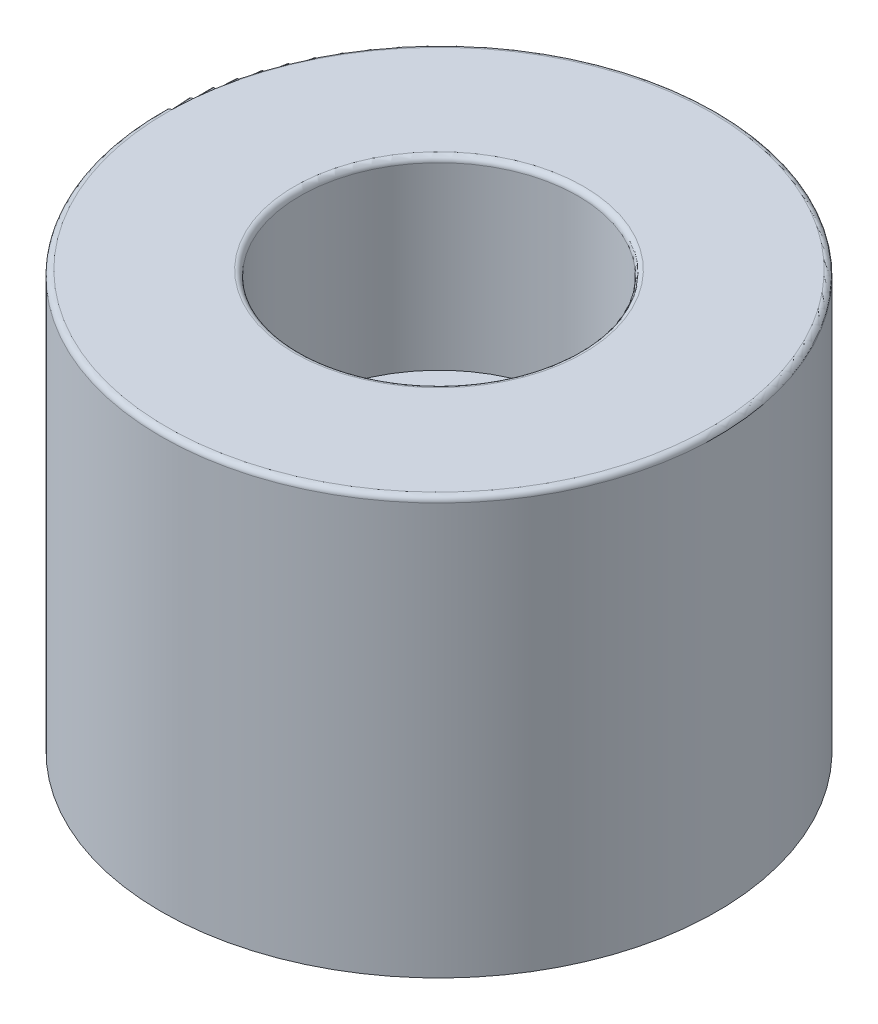
ISO-10303-21;
HEADER;
FILE_DESCRIPTION(('STEP AP214'),'2;1');
FILE_NAME('part.step','',(''),(''),'','','');
FILE_SCHEMA(('AUTOMOTIVE_DESIGN { 1 0 10303 214 1 1 1 1 }'));
ENDSEC;
DATA;
#1=APPLICATION_CONTEXT('core data for automotive mechanical design processes');
#2=APPLICATION_PROTOCOL_DEFINITION('international standard','automotive_design',2000,#1);
#3=PRODUCT_CONTEXT('',#1,'mechanical');
#4=PRODUCT('Part','Part','',(#3));
#5=PRODUCT_RELATED_PRODUCT_CATEGORY('part','',(#4));
#6=PRODUCT_DEFINITION_FORMATION('','',#4);
#7=PRODUCT_DEFINITION_CONTEXT('part definition',#1,'design');
#8=PRODUCT_DEFINITION('design','',#6,#7);
#9=PRODUCT_DEFINITION_SHAPE('','',#8);
#10=(LENGTH_UNIT() NAMED_UNIT(*) SI_UNIT(.MILLI.,.METRE.));
#11=(NAMED_UNIT(*) PLANE_ANGLE_UNIT() SI_UNIT($,.RADIAN.));
#12=(NAMED_UNIT(*) SI_UNIT($,.STERADIAN.) SOLID_ANGLE_UNIT());
#13=UNCERTAINTY_MEASURE_WITH_UNIT(LENGTH_MEASURE(1.E-05),#10,'distance_accuracy_value','');
#14=(GEOMETRIC_REPRESENTATION_CONTEXT(3) GLOBAL_UNCERTAINTY_ASSIGNED_CONTEXT((#13)) GLOBAL_UNIT_ASSIGNED_CONTEXT((#10,
#11,#12)) REPRESENTATION_CONTEXT('',''));
#15=CARTESIAN_POINT('',(0.,0.,0.));
#16=DIRECTION('',(0.,0.,1.));
#17=DIRECTION('',(1.,0.,0.));
#18=AXIS2_PLACEMENT_3D('',#15,#16,#17);
#19=CARTESIAN_POINT('',(-2.38125,-7.14375,0.));
#20=DIRECTION('',(0.,1.,0.));
#21=DIRECTION('',(0.,0.,1.));
#22=AXIS2_PLACEMENT_3D('',#19,#20,#21);
#23=PLANE('',#22);
#24=CARTESIAN_POINT('',(0.,-7.14375,0.));
#25=DIRECTION('',(0.,-1.,0.));
#26=DIRECTION('',(0.,0.,-1.));
#27=AXIS2_PLACEMENT_3D('',#24,#25,#26);
#28=CIRCLE('',#27,2.38125);
#29=CARTESIAN_POINT('',(0.,-7.14375,-2.38125));
#30=VERTEX_POINT('',#29);
#31=EDGE_CURVE('E83',#30,#30,#28,.T.);
#32=ORIENTED_EDGE('',*,*,#31,.F.);
#33=EDGE_LOOP('',(#32));
#34=FACE_BOUND('',#33,.T.);
#35=CARTESIAN_POINT('',(0.,-7.14375,0.));
#36=DIRECTION('',(0.,-1.,0.));
#37=DIRECTION('',(0.,0.,-1.));
#38=AXIS2_PLACEMENT_3D('',#35,#36,#37);
#39=CIRCLE('',#38,9.525);
#40=CARTESIAN_POINT('',(0.,-7.14375,-9.525));
#41=VERTEX_POINT('',#40);
#42=EDGE_CURVE('E71',#41,#41,#39,.T.);
#43=ORIENTED_EDGE('',*,*,#42,.T.);
#44=EDGE_LOOP('',(#43));
#45=FACE_BOUND('',#44,.T.);
#46=ADVANCED_FACE('F45',(#34,#45),#23,.F.);
#47=CARTESIAN_POINT('',(0.,-7.14375,0.));
#48=DIRECTION('',(0.,-1.,0.));
#49=DIRECTION('',(0.,0.,-1.));
#50=AXIS2_PLACEMENT_3D('',#47,#48,#49);
#51=CYLINDRICAL_SURFACE('',#50,9.525);
#52=CARTESIAN_POINT('',(0.,6.95325,0.));
#53=DIRECTION('',(0.,-1.,0.));
#54=DIRECTION('',(0.,0.,-1.));
#55=AXIS2_PLACEMENT_3D('',#52,#53,#54);
#56=CIRCLE('',#55,9.525);
#57=CARTESIAN_POINT('',(0.,6.95325,-9.525));
#58=VERTEX_POINT('',#57);
#59=EDGE_CURVE('E53',#58,#58,#56,.T.);
#60=ORIENTED_EDGE('',*,*,#59,.T.);
#61=EDGE_LOOP('',(#60));
#62=FACE_BOUND('',#61,.T.);
#63=ORIENTED_EDGE('',*,*,#42,.F.);
#64=EDGE_LOOP('',(#63));
#65=FACE_BOUND('',#64,.T.);
#66=ADVANCED_FACE('F93',(#62,#65),#51,.T.);
#67=CARTESIAN_POINT('',(-9.525,7.14375,0.));
#68=DIRECTION('',(0.,-1.,0.));
#69=DIRECTION('',(0.,0.,-1.));
#70=AXIS2_PLACEMENT_3D('',#67,#68,#69);
#71=PLANE('',#70);
#72=CARTESIAN_POINT('',(0.,7.14375,0.));
#73=DIRECTION('',(0.,-1.,0.));
#74=DIRECTION('',(0.,0.,-1.));
#75=AXIS2_PLACEMENT_3D('',#72,#73,#74);
#76=CIRCLE('',#75,9.3345);
#77=CARTESIAN_POINT('',(0.,7.14375,-9.3345));
#78=VERTEX_POINT('',#77);
#79=EDGE_CURVE('E10',#78,#78,#76,.F.);
#80=ORIENTED_EDGE('',*,*,#79,.T.);
#81=EDGE_LOOP('',(#80));
#82=FACE_BOUND('',#81,.T.);
#83=CARTESIAN_POINT('',(0.,7.14375,0.));
#84=DIRECTION('',(0.,-1.,0.));
#85=DIRECTION('',(0.,0.,-1.));
#86=AXIS2_PLACEMENT_3D('',#83,#84,#85);
#87=CIRCLE('',#86,4.953);
#88=CARTESIAN_POINT('',(0.,7.14375,-4.953));
#89=VERTEX_POINT('',#88);
#90=EDGE_CURVE('E65',#89,#89,#87,.T.);
#91=ORIENTED_EDGE('',*,*,#90,.T.);
#92=EDGE_LOOP('',(#91));
#93=FACE_BOUND('',#92,.T.);
#94=ADVANCED_FACE('F98',(#82,#93),#71,.F.);
#95=CARTESIAN_POINT('',(0.,-7.14375,0.));
#96=DIRECTION('',(0.,-1.,0.));
#97=DIRECTION('',(0.,0.,-1.));
#98=AXIS2_PLACEMENT_3D('',#95,#96,#97);
#99=CYLINDRICAL_SURFACE('',#98,4.7625);
#100=CARTESIAN_POINT('',(0.,6.95325,0.));
#101=DIRECTION('',(0.,-1.,0.));
#102=DIRECTION('',(0.,0.,-1.));
#103=AXIS2_PLACEMENT_3D('',#100,#101,#102);
#104=CIRCLE('',#103,4.7625);
#105=CARTESIAN_POINT('',(0.,6.95325,-4.7625));
#106=VERTEX_POINT('',#105);
#107=EDGE_CURVE('E59',#106,#106,#104,.F.);
#108=ORIENTED_EDGE('',*,*,#107,.T.);
#109=EDGE_LOOP('',(#108));
#110=FACE_BOUND('',#109,.T.);
#111=CARTESIAN_POINT('',(0.,0.793749999999999,0.));
#112=DIRECTION('',(0.,-1.,0.));
#113=DIRECTION('',(0.,0.,-1.));
#114=AXIS2_PLACEMENT_3D('',#111,#112,#113);
#115=CIRCLE('',#114,4.7625);
#116=CARTESIAN_POINT('',(0.,0.793749999999999,-4.7625));
#117=VERTEX_POINT('',#116);
#118=EDGE_CURVE('E75',#117,#117,#115,.T.);
#119=ORIENTED_EDGE('',*,*,#118,.T.);
#120=EDGE_LOOP('',(#119));
#121=FACE_BOUND('',#120,.T.);
#122=ADVANCED_FACE('F103',(#110,#121),#99,.F.);
#123=CARTESIAN_POINT('',(-4.7625,0.793749999999999,0.));
#124=DIRECTION('',(0.,-1.,0.));
#125=DIRECTION('',(0.,0.,-1.));
#126=AXIS2_PLACEMENT_3D('',#123,#124,#125);
#127=PLANE('',#126);
#128=ORIENTED_EDGE('',*,*,#118,.F.);
#129=EDGE_LOOP('',(#128));
#130=FACE_BOUND('',#129,.T.);
#131=CARTESIAN_POINT('',(0.,0.793749999999999,0.));
#132=DIRECTION('',(0.,-1.,0.));
#133=DIRECTION('',(0.,0.,-1.));
#134=AXIS2_PLACEMENT_3D('',#131,#132,#133);
#135=CIRCLE('',#134,2.38125);
#136=CARTESIAN_POINT('',(0.,0.793749999999999,-2.38125));
#137=VERTEX_POINT('',#136);
#138=EDGE_CURVE('E79',#137,#137,#135,.T.);
#139=ORIENTED_EDGE('',*,*,#138,.T.);
#140=EDGE_LOOP('',(#139));
#141=FACE_BOUND('',#140,.T.);
#142=ADVANCED_FACE('F114',(#130,#141),#127,.F.);
#143=CARTESIAN_POINT('',(0.,-7.14375,0.));
#144=DIRECTION('',(0.,-1.,0.));
#145=DIRECTION('',(0.,0.,-1.));
#146=AXIS2_PLACEMENT_3D('',#143,#144,#145);
#147=CYLINDRICAL_SURFACE('',#146,2.38125);
#148=ORIENTED_EDGE('',*,*,#138,.F.);
#149=EDGE_LOOP('',(#148));
#150=FACE_BOUND('',#149,.T.);
#151=ORIENTED_EDGE('',*,*,#31,.T.);
#152=EDGE_LOOP('',(#151));
#153=FACE_BOUND('',#152,.T.);
#154=ADVANCED_FACE('F89',(#150,#153),#147,.F.);
#155=CARTESIAN_POINT('',(0.,6.95325,0.));
#156=DIRECTION('',(0.,-1.,0.));
#157=DIRECTION('',(0.,0.,-1.));
#158=AXIS2_PLACEMENT_3D('',#155,#156,#157);
#159=TOROIDAL_SURFACE('',#158,4.953,0.1905);
#160=ORIENTED_EDGE('',*,*,#107,.F.);
#161=EDGE_LOOP('',(#160));
#162=FACE_BOUND('',#161,.T.);
#163=ORIENTED_EDGE('',*,*,#90,.F.);
#164=EDGE_LOOP('',(#163));
#165=FACE_BOUND('',#164,.T.);
#166=ADVANCED_FACE('F106',(#162,#165),#159,.T.);
#167=CARTESIAN_POINT('',(0.,6.95325,0.));
#168=DIRECTION('',(0.,-1.,0.));
#169=DIRECTION('',(0.,0.,-1.));
#170=AXIS2_PLACEMENT_3D('',#167,#168,#169);
#171=TOROIDAL_SURFACE('',#170,9.3345,0.1905);
#172=ORIENTED_EDGE('',*,*,#79,.F.);
#173=EDGE_LOOP('',(#172));
#174=FACE_BOUND('',#173,.T.);
#175=ORIENTED_EDGE('',*,*,#59,.F.);
#176=EDGE_LOOP('',(#175));
#177=FACE_BOUND('',#176,.T.);
#178=ADVANCED_FACE('F47',(#174,#177),#171,.T.);
#179=CLOSED_SHELL('',(#46,#66,#94,#122,#142,#154,#166,#178));
#180=MANIFOLD_SOLID_BREP('B2',#179);
#181=ADVANCED_BREP_SHAPE_REPRESENTATION('',(#18,#180),#14);
#182=SHAPE_DEFINITION_REPRESENTATION(#9,#181);
ENDSEC;
END-ISO-10303-21;
